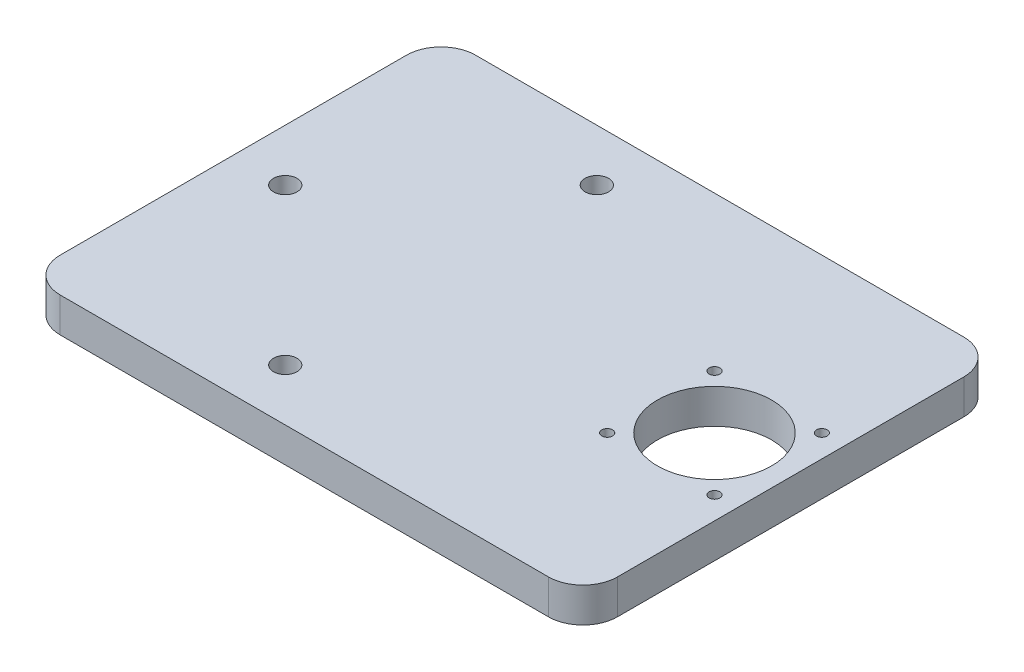
ISO-10303-21;
HEADER;
FILE_DESCRIPTION(('STEP AP214'),'2;1');
FILE_NAME('part.step','',(''),(''),'','','');
FILE_SCHEMA(('AUTOMOTIVE_DESIGN { 1 0 10303 214 1 1 1 1 }'));
ENDSEC;
DATA;
#1=APPLICATION_CONTEXT('core data for automotive mechanical design processes');
#2=APPLICATION_PROTOCOL_DEFINITION('international standard','automotive_design',2000,#1);
#3=PRODUCT_CONTEXT('',#1,'mechanical');
#4=PRODUCT('Part','Part','',(#3));
#5=PRODUCT_RELATED_PRODUCT_CATEGORY('part','',(#4));
#6=PRODUCT_DEFINITION_FORMATION('','',#4);
#7=PRODUCT_DEFINITION_CONTEXT('part definition',#1,'design');
#8=PRODUCT_DEFINITION('design','',#6,#7);
#9=PRODUCT_DEFINITION_SHAPE('','',#8);
#10=(LENGTH_UNIT() NAMED_UNIT(*) SI_UNIT(.MILLI.,.METRE.));
#11=(NAMED_UNIT(*) PLANE_ANGLE_UNIT() SI_UNIT($,.RADIAN.));
#12=(NAMED_UNIT(*) SI_UNIT($,.STERADIAN.) SOLID_ANGLE_UNIT());
#13=UNCERTAINTY_MEASURE_WITH_UNIT(LENGTH_MEASURE(1.E-05),#10,'distance_accuracy_value','');
#14=(GEOMETRIC_REPRESENTATION_CONTEXT(3) GLOBAL_UNCERTAINTY_ASSIGNED_CONTEXT((#13)) GLOBAL_UNIT_ASSIGNED_CONTEXT((#10,
#11,#12)) REPRESENTATION_CONTEXT('',''));
#15=CARTESIAN_POINT('',(0.,0.,0.));
#16=DIRECTION('',(0.,0.,1.));
#17=DIRECTION('',(1.,0.,0.));
#18=AXIS2_PLACEMENT_3D('',#15,#16,#17);
#19=CARTESIAN_POINT('',(80.5,10.,60.));
#20=DIRECTION('',(-1.,0.,0.));
#21=DIRECTION('',(0.,0.,1.));
#22=AXIS2_PLACEMENT_3D('',#19,#20,#21);
#23=PLANE('',#22);
#24=DIRECTION('',(0.,0.,-1.));
#25=VECTOR('',#24,1.);
#26=CARTESIAN_POINT('',(80.5,10.,60.));
#27=LINE('',#26,#25);
#28=CARTESIAN_POINT('',(80.5,10.,50.));
#29=VERTEX_POINT('',#28);
#30=CARTESIAN_POINT('',(80.5,10.,-50.));
#31=VERTEX_POINT('',#30);
#32=EDGE_CURVE('E236',#29,#31,#27,.T.);
#33=ORIENTED_EDGE('',*,*,#32,.F.);
#34=DIRECTION('',(0.,-1.,0.));
#35=VECTOR('',#34,1.);
#36=CARTESIAN_POINT('',(80.5,10.,50.));
#37=LINE('',#36,#35);
#38=CARTESIAN_POINT('',(80.5,0.,50.));
#39=VERTEX_POINT('',#38);
#40=EDGE_CURVE('E218',#29,#39,#37,.T.);
#41=ORIENTED_EDGE('',*,*,#40,.T.);
#42=DIRECTION('',(0.,0.,-1.));
#43=VECTOR('',#42,1.);
#44=CARTESIAN_POINT('',(80.5,0.,60.));
#45=LINE('',#44,#43);
#46=CARTESIAN_POINT('',(80.5,0.,-50.));
#47=VERTEX_POINT('',#46);
#48=EDGE_CURVE('E231',#39,#47,#45,.T.);
#49=ORIENTED_EDGE('',*,*,#48,.T.);
#50=DIRECTION('',(0.,-1.,0.));
#51=VECTOR('',#50,1.);
#52=CARTESIAN_POINT('',(80.5,10.,-50.));
#53=LINE('',#52,#51);
#54=EDGE_CURVE('E237',#47,#31,#53,.F.);
#55=ORIENTED_EDGE('',*,*,#54,.T.);
#56=EDGE_LOOP('',(#33,#41,#49,#55));
#57=FACE_BOUND('',#56,.T.);
#58=ADVANCED_FACE('F146',(#57),#23,.F.);
#59=CARTESIAN_POINT('',(-80.5,10.,-60.));
#60=DIRECTION('',(0.,0.,1.));
#61=DIRECTION('',(1.,0.,0.));
#62=AXIS2_PLACEMENT_3D('',#59,#60,#61);
#63=PLANE('',#62);
#64=DIRECTION('',(-1.,0.,0.));
#65=VECTOR('',#64,1.);
#66=CARTESIAN_POINT('',(-80.5,10.,-60.));
#67=LINE('',#66,#65);
#68=CARTESIAN_POINT('',(70.5,10.,-60.));
#69=VERTEX_POINT('',#68);
#70=CARTESIAN_POINT('',(-70.5,10.,-60.));
#71=VERTEX_POINT('',#70);
#72=EDGE_CURVE('E353',#69,#71,#67,.T.);
#73=ORIENTED_EDGE('',*,*,#72,.F.);
#74=DIRECTION('',(0.,-1.,0.));
#75=VECTOR('',#74,1.);
#76=CARTESIAN_POINT('',(70.5,10.,-60.));
#77=LINE('',#76,#75);
#78=CARTESIAN_POINT('',(70.5,0.,-60.));
#79=VERTEX_POINT('',#78);
#80=EDGE_CURVE('E295',#69,#79,#77,.T.);
#81=ORIENTED_EDGE('',*,*,#80,.T.);
#82=DIRECTION('',(-1.,0.,0.));
#83=VECTOR('',#82,1.);
#84=CARTESIAN_POINT('',(-80.5,0.,-60.));
#85=LINE('',#84,#83);
#86=CARTESIAN_POINT('',(-70.5,0.,-60.));
#87=VERTEX_POINT('',#86);
#88=EDGE_CURVE('E242',#79,#87,#85,.T.);
#89=ORIENTED_EDGE('',*,*,#88,.T.);
#90=DIRECTION('',(0.,-1.,0.));
#91=VECTOR('',#90,1.);
#92=CARTESIAN_POINT('',(-70.5,10.,-60.));
#93=LINE('',#92,#91);
#94=EDGE_CURVE('E293',#87,#71,#93,.F.);
#95=ORIENTED_EDGE('',*,*,#94,.T.);
#96=EDGE_LOOP('',(#73,#81,#89,#95));
#97=FACE_BOUND('',#96,.T.);
#98=ADVANCED_FACE('F441',(#97),#63,.F.);
#99=CARTESIAN_POINT('',(-80.5,10.,60.));
#100=DIRECTION('',(1.,0.,0.));
#101=DIRECTION('',(0.,0.,-1.));
#102=AXIS2_PLACEMENT_3D('',#99,#100,#101);
#103=PLANE('',#102);
#104=DIRECTION('',(0.,0.,1.));
#105=VECTOR('',#104,1.);
#106=CARTESIAN_POINT('',(-80.5,10.,60.));
#107=LINE('',#106,#105);
#108=CARTESIAN_POINT('',(-80.5,10.,-50.));
#109=VERTEX_POINT('',#108);
#110=CARTESIAN_POINT('',(-80.5,10.,50.));
#111=VERTEX_POINT('',#110);
#112=EDGE_CURVE('E346',#109,#111,#107,.T.);
#113=ORIENTED_EDGE('',*,*,#112,.F.);
#114=DIRECTION('',(0.,-1.,0.));
#115=VECTOR('',#114,1.);
#116=CARTESIAN_POINT('',(-80.5,10.,-50.));
#117=LINE('',#116,#115);
#118=CARTESIAN_POINT('',(-80.5,0.,-50.));
#119=VERTEX_POINT('',#118);
#120=EDGE_CURVE('E12',#109,#119,#117,.T.);
#121=ORIENTED_EDGE('',*,*,#120,.T.);
#122=DIRECTION('',(0.,0.,1.));
#123=VECTOR('',#122,1.);
#124=CARTESIAN_POINT('',(-80.5,0.,60.));
#125=LINE('',#124,#123);
#126=CARTESIAN_POINT('',(-80.5,0.,50.));
#127=VERTEX_POINT('',#126);
#128=EDGE_CURVE('E255',#119,#127,#125,.T.);
#129=ORIENTED_EDGE('',*,*,#128,.T.);
#130=DIRECTION('',(0.,-1.,0.));
#131=VECTOR('',#130,1.);
#132=CARTESIAN_POINT('',(-80.5,10.,50.));
#133=LINE('',#132,#131);
#134=EDGE_CURVE('E158',#127,#111,#133,.F.);
#135=ORIENTED_EDGE('',*,*,#134,.T.);
#136=EDGE_LOOP('',(#113,#121,#129,#135));
#137=FACE_BOUND('',#136,.T.);
#138=ADVANCED_FACE('F432',(#137),#103,.F.);
#139=CARTESIAN_POINT('',(-80.5,10.,60.));
#140=DIRECTION('',(0.,0.,-1.));
#141=DIRECTION('',(-1.,0.,0.));
#142=AXIS2_PLACEMENT_3D('',#139,#140,#141);
#143=PLANE('',#142);
#144=DIRECTION('',(1.,0.,0.));
#145=VECTOR('',#144,1.);
#146=CARTESIAN_POINT('',(-80.5,0.,60.));
#147=LINE('',#146,#145);
#148=CARTESIAN_POINT('',(-70.5,0.,60.));
#149=VERTEX_POINT('',#148);
#150=CARTESIAN_POINT('',(70.5,0.,60.));
#151=VERTEX_POINT('',#150);
#152=EDGE_CURVE('E265',#149,#151,#147,.T.);
#153=ORIENTED_EDGE('',*,*,#152,.T.);
#154=DIRECTION('',(0.,-1.,0.));
#155=VECTOR('',#154,1.);
#156=CARTESIAN_POINT('',(70.5,10.,60.));
#157=LINE('',#156,#155);
#158=CARTESIAN_POINT('',(70.5,10.,60.));
#159=VERTEX_POINT('',#158);
#160=EDGE_CURVE('E222',#151,#159,#157,.F.);
#161=ORIENTED_EDGE('',*,*,#160,.T.);
#162=DIRECTION('',(1.,0.,0.));
#163=VECTOR('',#162,1.);
#164=CARTESIAN_POINT('',(-80.5,10.,60.));
#165=LINE('',#164,#163);
#166=CARTESIAN_POINT('',(-70.5,10.,60.));
#167=VERTEX_POINT('',#166);
#168=EDGE_CURVE('E259',#167,#159,#165,.T.);
#169=ORIENTED_EDGE('',*,*,#168,.F.);
#170=DIRECTION('',(0.,-1.,0.));
#171=VECTOR('',#170,1.);
#172=CARTESIAN_POINT('',(-70.5,10.,60.));
#173=LINE('',#172,#171);
#174=EDGE_CURVE('E227',#167,#149,#173,.T.);
#175=ORIENTED_EDGE('',*,*,#174,.T.);
#176=EDGE_LOOP('',(#153,#161,#169,#175));
#177=FACE_BOUND('',#176,.T.);
#178=ADVANCED_FACE('F424',(#177),#143,.F.);
#179=CARTESIAN_POINT('',(0.,10.,0.));
#180=DIRECTION('',(0.,-1.,0.));
#181=DIRECTION('',(0.,0.,-1.));
#182=AXIS2_PLACEMENT_3D('',#179,#180,#181);
#183=PLANE('',#182);
#184=CARTESIAN_POINT('',(-20.4999999999996,10.,45.));
#185=DIRECTION('',(0.,-1.,0.));
#186=DIRECTION('',(0.,0.,-1.));
#187=AXIS2_PLACEMENT_3D('',#184,#185,#186);
#188=CIRCLE('',#187,3.4);
#189=CARTESIAN_POINT('',(-20.4999999999996,10.,41.6));
#190=VERTEX_POINT('',#189);
#191=EDGE_CURVE('E398',#190,#190,#188,.T.);
#192=ORIENTED_EDGE('',*,*,#191,.T.);
#193=EDGE_LOOP('',(#192));
#194=FACE_BOUND('',#193,.T.);
#195=CARTESIAN_POINT('',(-65.5,10.,3.51845289014996E-12));
#196=DIRECTION('',(0.,-1.,0.));
#197=DIRECTION('',(0.,0.,-1.));
#198=AXIS2_PLACEMENT_3D('',#195,#196,#197);
#199=CIRCLE('',#198,3.4);
#200=CARTESIAN_POINT('',(-65.5,10.,-3.39999999999648));
#201=VERTEX_POINT('',#200);
#202=EDGE_CURVE('E376',#201,#201,#199,.T.);
#203=ORIENTED_EDGE('',*,*,#202,.T.);
#204=EDGE_LOOP('',(#203));
#205=FACE_BOUND('',#204,.T.);
#206=CARTESIAN_POINT('',(-20.4999999999996,10.,-45.));
#207=DIRECTION('',(0.,-1.,0.));
#208=DIRECTION('',(0.,0.,-1.));
#209=AXIS2_PLACEMENT_3D('',#206,#207,#208);
#210=CIRCLE('',#209,3.4);
#211=CARTESIAN_POINT('',(-20.4999999999996,10.,-48.4));
#212=VERTEX_POINT('',#211);
#213=EDGE_CURVE('E380',#212,#212,#210,.T.);
#214=ORIENTED_EDGE('',*,*,#213,.T.);
#215=EDGE_LOOP('',(#214));
#216=FACE_BOUND('',#215,.T.);
#217=CARTESIAN_POINT('',(58.5000000000002,10.,2.72676846380104E-12));
#218=DIRECTION('',(0.,-1.,0.));
#219=DIRECTION('',(0.,0.,-1.));
#220=AXIS2_PLACEMENT_3D('',#217,#218,#219);
#221=CIRCLE('',#220,16.5);
#222=CARTESIAN_POINT('',(58.5000000000002,10.,-16.4999999999973));
#223=VERTEX_POINT('',#222);
#224=EDGE_CURVE('E394',#223,#223,#221,.T.);
#225=ORIENTED_EDGE('',*,*,#224,.T.);
#226=EDGE_LOOP('',(#225));
#227=FACE_BOUND('',#226,.T.);
#228=CARTESIAN_POINT('',(74.0000000000002,10.,15.5000000000027));
#229=DIRECTION('',(0.,1.,0.));
#230=DIRECTION('',(0.,0.,1.));
#231=AXIS2_PLACEMENT_3D('',#228,#229,#230);
#232=CIRCLE('',#231,1.54999999999999);
#233=CARTESIAN_POINT('',(74.0000000000002,10.,17.0500000000027));
#234=VERTEX_POINT('',#233);
#235=EDGE_CURVE('E405',#234,#234,#232,.T.);
#236=ORIENTED_EDGE('',*,*,#235,.F.);
#237=EDGE_LOOP('',(#236));
#238=FACE_BOUND('',#237,.T.);
#239=CARTESIAN_POINT('',(43.0000000000002,10.,-15.4999999999973));
#240=DIRECTION('',(0.,1.,0.));
#241=DIRECTION('',(0.,0.,1.));
#242=AXIS2_PLACEMENT_3D('',#239,#240,#241);
#243=CIRCLE('',#242,1.55);
#244=CARTESIAN_POINT('',(43.0000000000002,10.,-13.9499999999973));
#245=VERTEX_POINT('',#244);
#246=EDGE_CURVE('E408',#245,#245,#243,.T.);
#247=ORIENTED_EDGE('',*,*,#246,.F.);
#248=EDGE_LOOP('',(#247));
#249=FACE_BOUND('',#248,.T.);
#250=CARTESIAN_POINT('',(43.0000000000002,10.,15.5000000000027));
#251=DIRECTION('',(0.,1.,0.));
#252=DIRECTION('',(0.,0.,1.));
#253=AXIS2_PLACEMENT_3D('',#250,#251,#252);
#254=CIRCLE('',#253,1.55);
#255=CARTESIAN_POINT('',(43.0000000000002,10.,17.0500000000027));
#256=VERTEX_POINT('',#255);
#257=EDGE_CURVE('E361',#256,#256,#254,.T.);
#258=ORIENTED_EDGE('',*,*,#257,.F.);
#259=EDGE_LOOP('',(#258));
#260=FACE_BOUND('',#259,.T.);
#261=CARTESIAN_POINT('',(74.0000000000002,10.,-15.4999999999973));
#262=DIRECTION('',(0.,1.,0.));
#263=DIRECTION('',(0.,0.,1.));
#264=AXIS2_PLACEMENT_3D('',#261,#262,#263);
#265=CIRCLE('',#264,1.54999999999999);
#266=CARTESIAN_POINT('',(74.0000000000002,10.,-13.9499999999973));
#267=VERTEX_POINT('',#266);
#268=EDGE_CURVE('E253',#267,#267,#265,.T.);
#269=ORIENTED_EDGE('',*,*,#268,.F.);
#270=EDGE_LOOP('',(#269));
#271=FACE_BOUND('',#270,.T.);
#272=ORIENTED_EDGE('',*,*,#168,.T.);
#273=CARTESIAN_POINT('',(70.5,10.,50.));
#274=DIRECTION('',(0.,-1.,0.));
#275=DIRECTION('',(0.,0.,-1.));
#276=AXIS2_PLACEMENT_3D('',#273,#274,#275);
#277=CIRCLE('',#276,10.);
#278=EDGE_CURVE('E288',#159,#29,#277,.F.);
#279=ORIENTED_EDGE('',*,*,#278,.T.);
#280=ORIENTED_EDGE('',*,*,#32,.T.);
#281=CARTESIAN_POINT('',(70.5,10.,-50.));
#282=DIRECTION('',(0.,-1.,0.));
#283=DIRECTION('',(0.,0.,-1.));
#284=AXIS2_PLACEMENT_3D('',#281,#282,#283);
#285=CIRCLE('',#284,10.);
#286=EDGE_CURVE('E283',#31,#69,#285,.F.);
#287=ORIENTED_EDGE('',*,*,#286,.T.);
#288=ORIENTED_EDGE('',*,*,#72,.T.);
#289=CARTESIAN_POINT('',(-70.5,10.,-50.));
#290=DIRECTION('',(0.,-1.,0.));
#291=DIRECTION('',(0.,0.,-1.));
#292=AXIS2_PLACEMENT_3D('',#289,#290,#291);
#293=CIRCLE('',#292,10.);
#294=EDGE_CURVE('E171',#71,#109,#293,.F.);
#295=ORIENTED_EDGE('',*,*,#294,.T.);
#296=ORIENTED_EDGE('',*,*,#112,.T.);
#297=CARTESIAN_POINT('',(-70.5,10.,50.));
#298=DIRECTION('',(0.,-1.,0.));
#299=DIRECTION('',(0.,0.,-1.));
#300=AXIS2_PLACEMENT_3D('',#297,#298,#299);
#301=CIRCLE('',#300,10.);
#302=EDGE_CURVE('E278',#111,#167,#301,.F.);
#303=ORIENTED_EDGE('',*,*,#302,.T.);
#304=EDGE_LOOP('',(#272,#279,#280,#287,#288,#295,#296,#303));
#305=FACE_BOUND('',#304,.T.);
#306=ADVANCED_FACE('F421',(#194,#205,#216,#227,#238,#249,#260,#271,#305),#183,.F.);
#307=CARTESIAN_POINT('',(0.,0.,0.));
#308=DIRECTION('',(0.,-1.,0.));
#309=DIRECTION('',(0.,0.,-1.));
#310=AXIS2_PLACEMENT_3D('',#307,#308,#309);
#311=PLANE('',#310);
#312=CARTESIAN_POINT('',(-20.4999999999996,0.,45.));
#313=DIRECTION('',(0.,-1.,0.));
#314=DIRECTION('',(0.,0.,-1.));
#315=AXIS2_PLACEMENT_3D('',#312,#313,#314);
#316=CIRCLE('',#315,3.4);
#317=CARTESIAN_POINT('',(-20.4999999999996,0.,41.6));
#318=VERTEX_POINT('',#317);
#319=EDGE_CURVE('E501',#318,#318,#316,.T.);
#320=ORIENTED_EDGE('',*,*,#319,.F.);
#321=EDGE_LOOP('',(#320));
#322=FACE_BOUND('',#321,.T.);
#323=CARTESIAN_POINT('',(-65.5,0.,3.51845289014996E-12));
#324=DIRECTION('',(0.,-1.,0.));
#325=DIRECTION('',(0.,0.,-1.));
#326=AXIS2_PLACEMENT_3D('',#323,#324,#325);
#327=CIRCLE('',#326,3.4);
#328=CARTESIAN_POINT('',(-65.5,0.,-3.39999999999648));
#329=VERTEX_POINT('',#328);
#330=EDGE_CURVE('E503',#329,#329,#327,.T.);
#331=ORIENTED_EDGE('',*,*,#330,.F.);
#332=EDGE_LOOP('',(#331));
#333=FACE_BOUND('',#332,.T.);
#334=CARTESIAN_POINT('',(-20.4999999999996,0.,-45.));
#335=DIRECTION('',(0.,-1.,0.));
#336=DIRECTION('',(0.,0.,-1.));
#337=AXIS2_PLACEMENT_3D('',#334,#335,#336);
#338=CIRCLE('',#337,3.4);
#339=CARTESIAN_POINT('',(-20.4999999999996,0.,-48.4));
#340=VERTEX_POINT('',#339);
#341=EDGE_CURVE('E373',#340,#340,#338,.T.);
#342=ORIENTED_EDGE('',*,*,#341,.F.);
#343=EDGE_LOOP('',(#342));
#344=FACE_BOUND('',#343,.T.);
#345=CARTESIAN_POINT('',(58.5000000000002,0.,2.72676846380104E-12));
#346=DIRECTION('',(0.,-1.,0.));
#347=DIRECTION('',(0.,0.,-1.));
#348=AXIS2_PLACEMENT_3D('',#345,#346,#347);
#349=CIRCLE('',#348,16.5);
#350=CARTESIAN_POINT('',(58.5000000000002,0.,-16.4999999999973));
#351=VERTEX_POINT('',#350);
#352=EDGE_CURVE('E392',#351,#351,#349,.T.);
#353=ORIENTED_EDGE('',*,*,#352,.F.);
#354=EDGE_LOOP('',(#353));
#355=FACE_BOUND('',#354,.T.);
#356=CARTESIAN_POINT('',(74.0000000000002,0.,15.5000000000027));
#357=DIRECTION('',(0.,1.,0.));
#358=DIRECTION('',(0.,0.,1.));
#359=AXIS2_PLACEMENT_3D('',#356,#357,#358);
#360=CIRCLE('',#359,1.54999999999999);
#361=CARTESIAN_POINT('',(74.0000000000002,0.,17.0500000000027));
#362=VERTEX_POINT('',#361);
#363=EDGE_CURVE('E407',#362,#362,#360,.T.);
#364=ORIENTED_EDGE('',*,*,#363,.T.);
#365=EDGE_LOOP('',(#364));
#366=FACE_BOUND('',#365,.T.);
#367=CARTESIAN_POINT('',(43.0000000000002,0.,-15.4999999999973));
#368=DIRECTION('',(0.,1.,0.));
#369=DIRECTION('',(0.,0.,1.));
#370=AXIS2_PLACEMENT_3D('',#367,#368,#369);
#371=CIRCLE('',#370,1.55);
#372=CARTESIAN_POINT('',(43.0000000000002,0.,-13.9499999999973));
#373=VERTEX_POINT('',#372);
#374=EDGE_CURVE('E370',#373,#373,#371,.T.);
#375=ORIENTED_EDGE('',*,*,#374,.T.);
#376=EDGE_LOOP('',(#375));
#377=FACE_BOUND('',#376,.T.);
#378=CARTESIAN_POINT('',(43.0000000000002,0.,15.5000000000027));
#379=DIRECTION('',(0.,1.,0.));
#380=DIRECTION('',(0.,0.,1.));
#381=AXIS2_PLACEMENT_3D('',#378,#379,#380);
#382=CIRCLE('',#381,1.55);
#383=CARTESIAN_POINT('',(43.0000000000002,0.,17.0500000000027));
#384=VERTEX_POINT('',#383);
#385=EDGE_CURVE('E368',#384,#384,#382,.T.);
#386=ORIENTED_EDGE('',*,*,#385,.T.);
#387=EDGE_LOOP('',(#386));
#388=FACE_BOUND('',#387,.T.);
#389=CARTESIAN_POINT('',(74.0000000000002,0.,-15.4999999999973));
#390=DIRECTION('',(0.,1.,0.));
#391=DIRECTION('',(0.,0.,1.));
#392=AXIS2_PLACEMENT_3D('',#389,#390,#391);
#393=CIRCLE('',#392,1.54999999999999);
#394=CARTESIAN_POINT('',(74.0000000000002,0.,-13.9499999999973));
#395=VERTEX_POINT('',#394);
#396=EDGE_CURVE('E244',#395,#395,#393,.T.);
#397=ORIENTED_EDGE('',*,*,#396,.T.);
#398=EDGE_LOOP('',(#397));
#399=FACE_BOUND('',#398,.T.);
#400=ORIENTED_EDGE('',*,*,#48,.F.);
#401=CARTESIAN_POINT('',(70.5,0.,50.));
#402=DIRECTION('',(0.,-1.,0.));
#403=DIRECTION('',(0.,0.,-1.));
#404=AXIS2_PLACEMENT_3D('',#401,#402,#403);
#405=CIRCLE('',#404,10.);
#406=EDGE_CURVE('E217',#39,#151,#405,.T.);
#407=ORIENTED_EDGE('',*,*,#406,.T.);
#408=ORIENTED_EDGE('',*,*,#152,.F.);
#409=CARTESIAN_POINT('',(-70.5,0.,50.));
#410=DIRECTION('',(0.,-1.,0.));
#411=DIRECTION('',(0.,0.,-1.));
#412=AXIS2_PLACEMENT_3D('',#409,#410,#411);
#413=CIRCLE('',#412,10.);
#414=EDGE_CURVE('E238',#149,#127,#413,.T.);
#415=ORIENTED_EDGE('',*,*,#414,.T.);
#416=ORIENTED_EDGE('',*,*,#128,.F.);
#417=CARTESIAN_POINT('',(-70.5,0.,-50.));
#418=DIRECTION('',(0.,-1.,0.));
#419=DIRECTION('',(0.,0.,-1.));
#420=AXIS2_PLACEMENT_3D('',#417,#418,#419);
#421=CIRCLE('',#420,10.);
#422=EDGE_CURVE('E269',#119,#87,#421,.T.);
#423=ORIENTED_EDGE('',*,*,#422,.T.);
#424=ORIENTED_EDGE('',*,*,#88,.F.);
#425=CARTESIAN_POINT('',(70.5,0.,-50.));
#426=DIRECTION('',(0.,-1.,0.));
#427=DIRECTION('',(0.,0.,-1.));
#428=AXIS2_PLACEMENT_3D('',#425,#426,#427);
#429=CIRCLE('',#428,10.);
#430=EDGE_CURVE('E226',#79,#47,#429,.T.);
#431=ORIENTED_EDGE('',*,*,#430,.T.);
#432=EDGE_LOOP('',(#400,#407,#408,#415,#416,#423,#424,#431));
#433=FACE_BOUND('',#432,.T.);
#434=ADVANCED_FACE('F241',(#322,#333,#344,#355,#366,#377,#388,#399,#433),#311,.T.);
#435=CARTESIAN_POINT('',(70.5,10.,50.));
#436=DIRECTION('',(0.,-1.,0.));
#437=DIRECTION('',(0.,0.,-1.));
#438=AXIS2_PLACEMENT_3D('',#435,#436,#437);
#439=CYLINDRICAL_SURFACE('',#438,10.);
#440=ORIENTED_EDGE('',*,*,#278,.F.);
#441=ORIENTED_EDGE('',*,*,#160,.F.);
#442=ORIENTED_EDGE('',*,*,#406,.F.);
#443=ORIENTED_EDGE('',*,*,#40,.F.);
#444=EDGE_LOOP('',(#440,#441,#442,#443));
#445=FACE_BOUND('',#444,.T.);
#446=ADVANCED_FACE('F216',(#445),#439,.T.);
#447=CARTESIAN_POINT('',(70.5,10.,-50.));
#448=DIRECTION('',(0.,-1.,0.));
#449=DIRECTION('',(0.,0.,-1.));
#450=AXIS2_PLACEMENT_3D('',#447,#448,#449);
#451=CYLINDRICAL_SURFACE('',#450,10.);
#452=ORIENTED_EDGE('',*,*,#286,.F.);
#453=ORIENTED_EDGE('',*,*,#54,.F.);
#454=ORIENTED_EDGE('',*,*,#430,.F.);
#455=ORIENTED_EDGE('',*,*,#80,.F.);
#456=EDGE_LOOP('',(#452,#453,#454,#455));
#457=FACE_BOUND('',#456,.T.);
#458=ADVANCED_FACE('F444',(#457),#451,.T.);
#459=CARTESIAN_POINT('',(-70.5,10.,-50.));
#460=DIRECTION('',(0.,-1.,0.));
#461=DIRECTION('',(0.,0.,-1.));
#462=AXIS2_PLACEMENT_3D('',#459,#460,#461);
#463=CYLINDRICAL_SURFACE('',#462,10.);
#464=ORIENTED_EDGE('',*,*,#294,.F.);
#465=ORIENTED_EDGE('',*,*,#94,.F.);
#466=ORIENTED_EDGE('',*,*,#422,.F.);
#467=ORIENTED_EDGE('',*,*,#120,.F.);
#468=EDGE_LOOP('',(#464,#465,#466,#467));
#469=FACE_BOUND('',#468,.T.);
#470=ADVANCED_FACE('F440',(#469),#463,.T.);
#471=CARTESIAN_POINT('',(-70.5,10.,50.));
#472=DIRECTION('',(0.,-1.,0.));
#473=DIRECTION('',(0.,0.,-1.));
#474=AXIS2_PLACEMENT_3D('',#471,#472,#473);
#475=CYLINDRICAL_SURFACE('',#474,10.);
#476=ORIENTED_EDGE('',*,*,#302,.F.);
#477=ORIENTED_EDGE('',*,*,#134,.F.);
#478=ORIENTED_EDGE('',*,*,#414,.F.);
#479=ORIENTED_EDGE('',*,*,#174,.F.);
#480=EDGE_LOOP('',(#476,#477,#478,#479));
#481=FACE_BOUND('',#480,.T.);
#482=ADVANCED_FACE('F152',(#481),#475,.T.);
#483=CARTESIAN_POINT('',(74.0000000000002,0.,-15.4999999999973));
#484=DIRECTION('',(0.,1.,0.));
#485=DIRECTION('',(0.,0.,1.));
#486=AXIS2_PLACEMENT_3D('',#483,#484,#485);
#487=CYLINDRICAL_SURFACE('',#486,1.54999999999999);
#488=ORIENTED_EDGE('',*,*,#396,.F.);
#489=EDGE_LOOP('',(#488));
#490=FACE_BOUND('',#489,.T.);
#491=ORIENTED_EDGE('',*,*,#268,.T.);
#492=EDGE_LOOP('',(#491));
#493=FACE_BOUND('',#492,.T.);
#494=ADVANCED_FACE('F423',(#490,#493),#487,.F.);
#495=CARTESIAN_POINT('',(43.0000000000002,0.,15.5000000000027));
#496=DIRECTION('',(0.,1.,0.));
#497=DIRECTION('',(0.,0.,1.));
#498=AXIS2_PLACEMENT_3D('',#495,#496,#497);
#499=CYLINDRICAL_SURFACE('',#498,1.55);
#500=ORIENTED_EDGE('',*,*,#385,.F.);
#501=EDGE_LOOP('',(#500));
#502=FACE_BOUND('',#501,.T.);
#503=ORIENTED_EDGE('',*,*,#257,.T.);
#504=EDGE_LOOP('',(#503));
#505=FACE_BOUND('',#504,.T.);
#506=ADVANCED_FACE('F470',(#502,#505),#499,.F.);
#507=CARTESIAN_POINT('',(43.0000000000002,0.,-15.4999999999973));
#508=DIRECTION('',(0.,1.,0.));
#509=DIRECTION('',(0.,0.,1.));
#510=AXIS2_PLACEMENT_3D('',#507,#508,#509);
#511=CYLINDRICAL_SURFACE('',#510,1.55);
#512=ORIENTED_EDGE('',*,*,#374,.F.);
#513=EDGE_LOOP('',(#512));
#514=FACE_BOUND('',#513,.T.);
#515=ORIENTED_EDGE('',*,*,#246,.T.);
#516=EDGE_LOOP('',(#515));
#517=FACE_BOUND('',#516,.T.);
#518=ADVANCED_FACE('F469',(#514,#517),#511,.F.);
#519=CARTESIAN_POINT('',(74.0000000000002,0.,15.5000000000027));
#520=DIRECTION('',(0.,1.,0.));
#521=DIRECTION('',(0.,0.,1.));
#522=AXIS2_PLACEMENT_3D('',#519,#520,#521);
#523=CYLINDRICAL_SURFACE('',#522,1.54999999999999);
#524=ORIENTED_EDGE('',*,*,#363,.F.);
#525=EDGE_LOOP('',(#524));
#526=FACE_BOUND('',#525,.T.);
#527=ORIENTED_EDGE('',*,*,#235,.T.);
#528=EDGE_LOOP('',(#527));
#529=FACE_BOUND('',#528,.T.);
#530=ADVANCED_FACE('F475',(#526,#529),#523,.F.);
#531=CARTESIAN_POINT('',(58.5000000000002,10.,2.72676846380104E-12));
#532=DIRECTION('',(0.,-1.,0.));
#533=DIRECTION('',(0.,0.,-1.));
#534=AXIS2_PLACEMENT_3D('',#531,#532,#533);
#535=CYLINDRICAL_SURFACE('',#534,16.5);
#536=ORIENTED_EDGE('',*,*,#224,.F.);
#537=EDGE_LOOP('',(#536));
#538=FACE_BOUND('',#537,.T.);
#539=ORIENTED_EDGE('',*,*,#352,.T.);
#540=EDGE_LOOP('',(#539));
#541=FACE_BOUND('',#540,.T.);
#542=ADVANCED_FACE('F477',(#538,#541),#535,.F.);
#543=CARTESIAN_POINT('',(-20.4999999999996,10.,-45.));
#544=DIRECTION('',(0.,-1.,0.));
#545=DIRECTION('',(0.,0.,-1.));
#546=AXIS2_PLACEMENT_3D('',#543,#544,#545);
#547=CYLINDRICAL_SURFACE('',#546,3.4);
#548=ORIENTED_EDGE('',*,*,#213,.F.);
#549=EDGE_LOOP('',(#548));
#550=FACE_BOUND('',#549,.T.);
#551=ORIENTED_EDGE('',*,*,#341,.T.);
#552=EDGE_LOOP('',(#551));
#553=FACE_BOUND('',#552,.T.);
#554=ADVANCED_FACE('F483',(#550,#553),#547,.F.);
#555=CARTESIAN_POINT('',(-65.5,10.,3.51845289014996E-12));
#556=DIRECTION('',(0.,-1.,0.));
#557=DIRECTION('',(0.,0.,-1.));
#558=AXIS2_PLACEMENT_3D('',#555,#556,#557);
#559=CYLINDRICAL_SURFACE('',#558,3.4);
#560=ORIENTED_EDGE('',*,*,#202,.F.);
#561=EDGE_LOOP('',(#560));
#562=FACE_BOUND('',#561,.T.);
#563=ORIENTED_EDGE('',*,*,#330,.T.);
#564=EDGE_LOOP('',(#563));
#565=FACE_BOUND('',#564,.T.);
#566=ADVANCED_FACE('F487',(#562,#565),#559,.F.);
#567=CARTESIAN_POINT('',(-20.4999999999996,10.,45.));
#568=DIRECTION('',(0.,-1.,0.));
#569=DIRECTION('',(0.,0.,-1.));
#570=AXIS2_PLACEMENT_3D('',#567,#568,#569);
#571=CYLINDRICAL_SURFACE('',#570,3.4);
#572=ORIENTED_EDGE('',*,*,#191,.F.);
#573=EDGE_LOOP('',(#572));
#574=FACE_BOUND('',#573,.T.);
#575=ORIENTED_EDGE('',*,*,#319,.T.);
#576=EDGE_LOOP('',(#575));
#577=FACE_BOUND('',#576,.T.);
#578=ADVANCED_FACE('F493',(#574,#577),#571,.F.);
#579=CLOSED_SHELL('',(#58,#98,#138,#178,#306,#434,#446,#458,#470,#482,#494,#506,#518,#530,#542,
#554,#566,#578));
#580=MANIFOLD_SOLID_BREP('B2',#579);
#581=ADVANCED_BREP_SHAPE_REPRESENTATION('',(#18,#580),#14);
#582=SHAPE_DEFINITION_REPRESENTATION(#9,#581);
ENDSEC;
END-ISO-10303-21;
